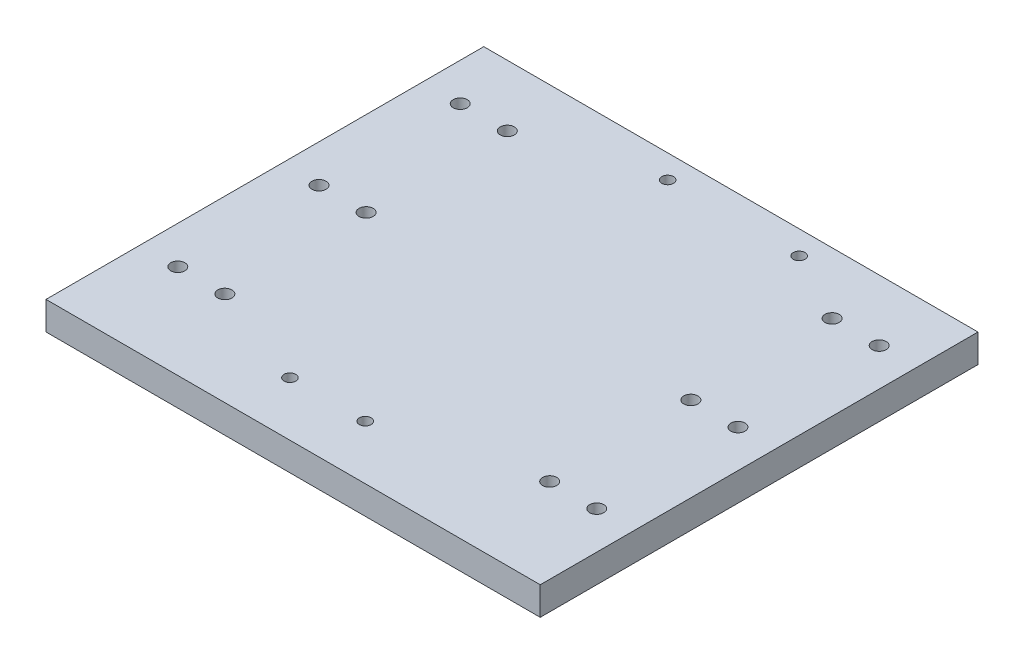
ISO-10303-21;
HEADER;
FILE_DESCRIPTION(('STEP AP214'),'2;1');
FILE_NAME('part.step','',(''),(''),'','','');
FILE_SCHEMA(('AUTOMOTIVE_DESIGN { 1 0 10303 214 1 1 1 1 }'));
ENDSEC;
DATA;
#1=APPLICATION_CONTEXT('core data for automotive mechanical design processes');
#2=APPLICATION_PROTOCOL_DEFINITION('international standard','automotive_design',2000,#1);
#3=PRODUCT_CONTEXT('',#1,'mechanical');
#4=PRODUCT('Part','Part','',(#3));
#5=PRODUCT_RELATED_PRODUCT_CATEGORY('part','',(#4));
#6=PRODUCT_DEFINITION_FORMATION('','',#4);
#7=PRODUCT_DEFINITION_CONTEXT('part definition',#1,'design');
#8=PRODUCT_DEFINITION('design','',#6,#7);
#9=PRODUCT_DEFINITION_SHAPE('','',#8);
#10=(LENGTH_UNIT() NAMED_UNIT(*) SI_UNIT(.MILLI.,.METRE.));
#11=(NAMED_UNIT(*) PLANE_ANGLE_UNIT() SI_UNIT($,.RADIAN.));
#12=(NAMED_UNIT(*) SI_UNIT($,.STERADIAN.) SOLID_ANGLE_UNIT());
#13=UNCERTAINTY_MEASURE_WITH_UNIT(LENGTH_MEASURE(1.E-05),#10,'distance_accuracy_value','');
#14=(GEOMETRIC_REPRESENTATION_CONTEXT(3) GLOBAL_UNCERTAINTY_ASSIGNED_CONTEXT((#13)) GLOBAL_UNIT_ASSIGNED_CONTEXT((#10,
#11,#12)) REPRESENTATION_CONTEXT('',''));
#15=CARTESIAN_POINT('',(0.,0.,0.));
#16=DIRECTION('',(0.,0.,1.));
#17=DIRECTION('',(1.,0.,0.));
#18=AXIS2_PLACEMENT_3D('',#15,#16,#17);
#19=CARTESIAN_POINT('',(0.,6.,0.));
#20=DIRECTION('',(0.,1.,0.));
#21=DIRECTION('',(0.,0.,1.));
#22=AXIS2_PLACEMENT_3D('',#19,#20,#21);
#23=PLANE('',#22);
#24=CARTESIAN_POINT('',(-12.18,6.,-11.5));
#25=DIRECTION('',(0.,1.,0.));
#26=DIRECTION('',(0.,0.,1.));
#27=AXIS2_PLACEMENT_3D('',#24,#25,#26);
#28=CIRCLE('',#27,1.25);
#29=CARTESIAN_POINT('',(-12.18,6.,-10.25));
#30=VERTEX_POINT('',#29);
#31=EDGE_CURVE('E193',#30,#30,#28,.T.);
#32=ORIENTED_EDGE('',*,*,#31,.F.);
#33=EDGE_LOOP('',(#32));
#34=FACE_BOUND('',#33,.T.);
#35=CARTESIAN_POINT('',(-8.44000000000004,6.,-88.));
#36=DIRECTION('',(0.,1.,0.));
#37=DIRECTION('',(0.,0.,1.));
#38=AXIS2_PLACEMENT_3D('',#35,#36,#37);
#39=CIRCLE('',#38,1.25);
#40=CARTESIAN_POINT('',(-8.44000000000004,6.,-86.75));
#41=VERTEX_POINT('',#40);
#42=EDGE_CURVE('E181',#41,#41,#39,.T.);
#43=ORIENTED_EDGE('',*,*,#42,.F.);
#44=EDGE_LOOP('',(#43));
#45=FACE_BOUND('',#44,.T.);
#46=CARTESIAN_POINT('',(-44.5,6.,-80.));
#47=DIRECTION('',(0.,1.,0.));
#48=DIRECTION('',(0.,0.,-1.));
#49=AXIS2_PLACEMENT_3D('',#46,#47,#48);
#50=CIRCLE('',#49,1.5);
#51=CARTESIAN_POINT('',(-44.5,6.,-81.5));
#52=VERTEX_POINT('',#51);
#53=EDGE_CURVE('E169',#52,#52,#50,.T.);
#54=ORIENTED_EDGE('',*,*,#53,.F.);
#55=EDGE_LOOP('',(#54));
#56=FACE_BOUND('',#55,.T.);
#57=CARTESIAN_POINT('',(-44.5,6.,-50.));
#58=DIRECTION('',(0.,1.,0.));
#59=DIRECTION('',(0.,0.,-1.));
#60=AXIS2_PLACEMENT_3D('',#57,#58,#59);
#61=CIRCLE('',#60,1.5);
#62=CARTESIAN_POINT('',(-44.5,6.,-51.5));
#63=VERTEX_POINT('',#62);
#64=EDGE_CURVE('E157',#63,#63,#61,.T.);
#65=ORIENTED_EDGE('',*,*,#64,.F.);
#66=EDGE_LOOP('',(#65));
#67=FACE_BOUND('',#66,.T.);
#68=CARTESIAN_POINT('',(-44.5,6.,-20.));
#69=DIRECTION('',(0.,1.,0.));
#70=DIRECTION('',(0.,0.,-1.));
#71=AXIS2_PLACEMENT_3D('',#68,#69,#70);
#72=CIRCLE('',#71,1.5);
#73=CARTESIAN_POINT('',(-44.5,6.,-21.5));
#74=VERTEX_POINT('',#73);
#75=EDGE_CURVE('E145',#74,#74,#72,.T.);
#76=ORIENTED_EDGE('',*,*,#75,.F.);
#77=EDGE_LOOP('',(#76));
#78=FACE_BOUND('',#77,.T.);
#79=CARTESIAN_POINT('',(34.5,6.,-20.));
#80=DIRECTION('',(0.,1.,0.));
#81=DIRECTION('',(0.,0.,1.));
#82=AXIS2_PLACEMENT_3D('',#79,#80,#81);
#83=CIRCLE('',#82,1.5);
#84=CARTESIAN_POINT('',(34.5,6.,-18.5));
#85=VERTEX_POINT('',#84);
#86=EDGE_CURVE('E133',#85,#85,#83,.T.);
#87=ORIENTED_EDGE('',*,*,#86,.F.);
#88=EDGE_LOOP('',(#87));
#89=FACE_BOUND('',#88,.T.);
#90=CARTESIAN_POINT('',(34.5,6.,-50.));
#91=DIRECTION('',(0.,1.,0.));
#92=DIRECTION('',(0.,0.,1.));
#93=AXIS2_PLACEMENT_3D('',#90,#91,#92);
#94=CIRCLE('',#93,1.5);
#95=CARTESIAN_POINT('',(34.5,6.,-48.5));
#96=VERTEX_POINT('',#95);
#97=EDGE_CURVE('E121',#96,#96,#94,.T.);
#98=ORIENTED_EDGE('',*,*,#97,.F.);
#99=EDGE_LOOP('',(#98));
#100=FACE_BOUND('',#99,.T.);
#101=CARTESIAN_POINT('',(34.5,6.,-80.));
#102=DIRECTION('',(0.,1.,0.));
#103=DIRECTION('',(0.,0.,1.));
#104=AXIS2_PLACEMENT_3D('',#101,#102,#103);
#105=CIRCLE('',#104,1.5);
#106=CARTESIAN_POINT('',(34.5,6.,-78.5));
#107=VERTEX_POINT('',#106);
#108=EDGE_CURVE('E100',#107,#107,#105,.T.);
#109=ORIENTED_EDGE('',*,*,#108,.F.);
#110=EDGE_LOOP('',(#109));
#111=FACE_BOUND('',#110,.T.);
#112=DIRECTION('',(0.,0.,1.));
#113=VECTOR('',#112,1.);
#114=CARTESIAN_POINT('',(-52.5,6.,-93.));
#115=LINE('',#114,#113);
#116=CARTESIAN_POINT('',(-52.5,6.,-93.));
#117=VERTEX_POINT('',#116);
#118=CARTESIAN_POINT('',(-52.5,6.,0.));
#119=VERTEX_POINT('',#118);
#120=EDGE_CURVE('E85',#117,#119,#115,.T.);
#121=ORIENTED_EDGE('',*,*,#120,.T.);
#122=DIRECTION('',(1.,0.,0.));
#123=VECTOR('',#122,1.);
#124=CARTESIAN_POINT('',(-52.5,6.,0.));
#125=LINE('',#124,#123);
#126=CARTESIAN_POINT('',(52.5,6.,0.));
#127=VERTEX_POINT('',#126);
#128=EDGE_CURVE('E80',#119,#127,#125,.T.);
#129=ORIENTED_EDGE('',*,*,#128,.T.);
#130=DIRECTION('',(0.,0.,-1.));
#131=VECTOR('',#130,1.);
#132=CARTESIAN_POINT('',(52.5,6.,-93.));
#133=LINE('',#132,#131);
#134=CARTESIAN_POINT('',(52.5,6.,-93.));
#135=VERTEX_POINT('',#134);
#136=EDGE_CURVE('E83',#127,#135,#133,.T.);
#137=ORIENTED_EDGE('',*,*,#136,.T.);
#138=DIRECTION('',(-1.,0.,0.));
#139=VECTOR('',#138,1.);
#140=CARTESIAN_POINT('',(-52.5,6.,-93.));
#141=LINE('',#140,#139);
#142=EDGE_CURVE('E50',#135,#117,#141,.T.);
#143=ORIENTED_EDGE('',*,*,#142,.T.);
#144=EDGE_LOOP('',(#121,#129,#137,#143));
#145=FACE_BOUND('',#144,.T.);
#146=CARTESIAN_POINT('',(44.5,6.,-80.));
#147=DIRECTION('',(0.,1.,0.));
#148=DIRECTION('',(0.,0.,1.));
#149=AXIS2_PLACEMENT_3D('',#146,#147,#148);
#150=CIRCLE('',#149,1.5);
#151=CARTESIAN_POINT('',(44.5,6.,-78.5));
#152=VERTEX_POINT('',#151);
#153=EDGE_CURVE('E115',#152,#152,#150,.T.);
#154=ORIENTED_EDGE('',*,*,#153,.F.);
#155=EDGE_LOOP('',(#154));
#156=FACE_BOUND('',#155,.T.);
#157=CARTESIAN_POINT('',(44.5,6.,-50.));
#158=DIRECTION('',(0.,1.,0.));
#159=DIRECTION('',(0.,0.,1.));
#160=AXIS2_PLACEMENT_3D('',#157,#158,#159);
#161=CIRCLE('',#160,1.5);
#162=CARTESIAN_POINT('',(44.5,6.,-48.5));
#163=VERTEX_POINT('',#162);
#164=EDGE_CURVE('E127',#163,#163,#161,.T.);
#165=ORIENTED_EDGE('',*,*,#164,.F.);
#166=EDGE_LOOP('',(#165));
#167=FACE_BOUND('',#166,.T.);
#168=CARTESIAN_POINT('',(44.5,6.,-20.));
#169=DIRECTION('',(0.,1.,0.));
#170=DIRECTION('',(0.,0.,1.));
#171=AXIS2_PLACEMENT_3D('',#168,#169,#170);
#172=CIRCLE('',#171,1.5);
#173=CARTESIAN_POINT('',(44.5,6.,-18.5));
#174=VERTEX_POINT('',#173);
#175=EDGE_CURVE('E139',#174,#174,#172,.T.);
#176=ORIENTED_EDGE('',*,*,#175,.F.);
#177=EDGE_LOOP('',(#176));
#178=FACE_BOUND('',#177,.T.);
#179=CARTESIAN_POINT('',(-34.5,6.,-20.));
#180=DIRECTION('',(0.,1.,0.));
#181=DIRECTION('',(0.,0.,-1.));
#182=AXIS2_PLACEMENT_3D('',#179,#180,#181);
#183=CIRCLE('',#182,1.5);
#184=CARTESIAN_POINT('',(-34.5,6.,-21.5));
#185=VERTEX_POINT('',#184);
#186=EDGE_CURVE('E151',#185,#185,#183,.T.);
#187=ORIENTED_EDGE('',*,*,#186,.F.);
#188=EDGE_LOOP('',(#187));
#189=FACE_BOUND('',#188,.T.);
#190=CARTESIAN_POINT('',(-34.5,6.,-50.));
#191=DIRECTION('',(0.,1.,0.));
#192=DIRECTION('',(0.,0.,-1.));
#193=AXIS2_PLACEMENT_3D('',#190,#191,#192);
#194=CIRCLE('',#193,1.5);
#195=CARTESIAN_POINT('',(-34.5,6.,-51.5));
#196=VERTEX_POINT('',#195);
#197=EDGE_CURVE('E163',#196,#196,#194,.T.);
#198=ORIENTED_EDGE('',*,*,#197,.F.);
#199=EDGE_LOOP('',(#198));
#200=FACE_BOUND('',#199,.T.);
#201=CARTESIAN_POINT('',(-34.5,6.,-80.));
#202=DIRECTION('',(0.,1.,0.));
#203=DIRECTION('',(0.,0.,-1.));
#204=AXIS2_PLACEMENT_3D('',#201,#202,#203);
#205=CIRCLE('',#204,1.5);
#206=CARTESIAN_POINT('',(-34.5,6.,-81.5));
#207=VERTEX_POINT('',#206);
#208=EDGE_CURVE('E175',#207,#207,#205,.T.);
#209=ORIENTED_EDGE('',*,*,#208,.F.);
#210=EDGE_LOOP('',(#209));
#211=FACE_BOUND('',#210,.T.);
#212=CARTESIAN_POINT('',(19.5,6.,-88.));
#213=DIRECTION('',(0.,1.,0.));
#214=DIRECTION('',(0.,0.,1.));
#215=AXIS2_PLACEMENT_3D('',#212,#213,#214);
#216=CIRCLE('',#215,1.25);
#217=CARTESIAN_POINT('',(19.5,6.,-86.75));
#218=VERTEX_POINT('',#217);
#219=EDGE_CURVE('E187',#218,#218,#216,.T.);
#220=ORIENTED_EDGE('',*,*,#219,.F.);
#221=EDGE_LOOP('',(#220));
#222=FACE_BOUND('',#221,.T.);
#223=CARTESIAN_POINT('',(3.81999999999997,6.,-11.5));
#224=DIRECTION('',(0.,1.,0.));
#225=DIRECTION('',(0.,0.,1.));
#226=AXIS2_PLACEMENT_3D('',#223,#224,#225);
#227=CIRCLE('',#226,1.25);
#228=CARTESIAN_POINT('',(3.81999999999997,6.,-10.25));
#229=VERTEX_POINT('',#228);
#230=EDGE_CURVE('E199',#229,#229,#227,.T.);
#231=ORIENTED_EDGE('',*,*,#230,.F.);
#232=EDGE_LOOP('',(#231));
#233=FACE_BOUND('',#232,.T.);
#234=ADVANCED_FACE('F33',(#34,#45,#56,#67,#78,#89,#100,#111,#145,#156,#167,#178,#189,#200,#211,
#222,#233),#23,.T.);
#235=CARTESIAN_POINT('',(0.,0.,0.));
#236=DIRECTION('',(0.,1.,0.));
#237=DIRECTION('',(0.,0.,1.));
#238=AXIS2_PLACEMENT_3D('',#235,#236,#237);
#239=PLANE('',#238);
#240=CARTESIAN_POINT('',(-12.18,0.,-11.5));
#241=DIRECTION('',(0.,1.,0.));
#242=DIRECTION('',(0.,0.,1.));
#243=AXIS2_PLACEMENT_3D('',#240,#241,#242);
#244=CIRCLE('',#243,1.25);
#245=CARTESIAN_POINT('',(-12.18,0.,-10.25));
#246=VERTEX_POINT('',#245);
#247=EDGE_CURVE('E196',#246,#246,#244,.T.);
#248=ORIENTED_EDGE('',*,*,#247,.T.);
#249=EDGE_LOOP('',(#248));
#250=FACE_BOUND('',#249,.T.);
#251=CARTESIAN_POINT('',(-8.44000000000004,0.,-88.));
#252=DIRECTION('',(0.,1.,0.));
#253=DIRECTION('',(0.,0.,1.));
#254=AXIS2_PLACEMENT_3D('',#251,#252,#253);
#255=CIRCLE('',#254,1.25);
#256=CARTESIAN_POINT('',(-8.44000000000004,0.,-86.75));
#257=VERTEX_POINT('',#256);
#258=EDGE_CURVE('E184',#257,#257,#255,.T.);
#259=ORIENTED_EDGE('',*,*,#258,.T.);
#260=EDGE_LOOP('',(#259));
#261=FACE_BOUND('',#260,.T.);
#262=CARTESIAN_POINT('',(-44.5,0.,-80.));
#263=DIRECTION('',(0.,1.,0.));
#264=DIRECTION('',(0.,0.,-1.));
#265=AXIS2_PLACEMENT_3D('',#262,#263,#264);
#266=CIRCLE('',#265,1.5);
#267=CARTESIAN_POINT('',(-44.5,0.,-81.5));
#268=VERTEX_POINT('',#267);
#269=EDGE_CURVE('E172',#268,#268,#266,.T.);
#270=ORIENTED_EDGE('',*,*,#269,.T.);
#271=EDGE_LOOP('',(#270));
#272=FACE_BOUND('',#271,.T.);
#273=CARTESIAN_POINT('',(-44.5,0.,-50.));
#274=DIRECTION('',(0.,1.,0.));
#275=DIRECTION('',(0.,0.,-1.));
#276=AXIS2_PLACEMENT_3D('',#273,#274,#275);
#277=CIRCLE('',#276,1.5);
#278=CARTESIAN_POINT('',(-44.5,0.,-51.5));
#279=VERTEX_POINT('',#278);
#280=EDGE_CURVE('E160',#279,#279,#277,.T.);
#281=ORIENTED_EDGE('',*,*,#280,.T.);
#282=EDGE_LOOP('',(#281));
#283=FACE_BOUND('',#282,.T.);
#284=CARTESIAN_POINT('',(-44.5,0.,-20.));
#285=DIRECTION('',(0.,1.,0.));
#286=DIRECTION('',(0.,0.,-1.));
#287=AXIS2_PLACEMENT_3D('',#284,#285,#286);
#288=CIRCLE('',#287,1.5);
#289=CARTESIAN_POINT('',(-44.5,0.,-21.5));
#290=VERTEX_POINT('',#289);
#291=EDGE_CURVE('E148',#290,#290,#288,.T.);
#292=ORIENTED_EDGE('',*,*,#291,.T.);
#293=EDGE_LOOP('',(#292));
#294=FACE_BOUND('',#293,.T.);
#295=CARTESIAN_POINT('',(34.5,0.,-20.));
#296=DIRECTION('',(0.,1.,0.));
#297=DIRECTION('',(0.,0.,1.));
#298=AXIS2_PLACEMENT_3D('',#295,#296,#297);
#299=CIRCLE('',#298,1.5);
#300=CARTESIAN_POINT('',(34.5,0.,-18.5));
#301=VERTEX_POINT('',#300);
#302=EDGE_CURVE('E136',#301,#301,#299,.T.);
#303=ORIENTED_EDGE('',*,*,#302,.T.);
#304=EDGE_LOOP('',(#303));
#305=FACE_BOUND('',#304,.T.);
#306=CARTESIAN_POINT('',(34.5,0.,-50.));
#307=DIRECTION('',(0.,1.,0.));
#308=DIRECTION('',(0.,0.,1.));
#309=AXIS2_PLACEMENT_3D('',#306,#307,#308);
#310=CIRCLE('',#309,1.5);
#311=CARTESIAN_POINT('',(34.5,0.,-48.5));
#312=VERTEX_POINT('',#311);
#313=EDGE_CURVE('E124',#312,#312,#310,.T.);
#314=ORIENTED_EDGE('',*,*,#313,.T.);
#315=EDGE_LOOP('',(#314));
#316=FACE_BOUND('',#315,.T.);
#317=CARTESIAN_POINT('',(34.5,0.,-80.));
#318=DIRECTION('',(0.,1.,0.));
#319=DIRECTION('',(0.,0.,1.));
#320=AXIS2_PLACEMENT_3D('',#317,#318,#319);
#321=CIRCLE('',#320,1.5);
#322=CARTESIAN_POINT('',(34.5,0.,-78.5));
#323=VERTEX_POINT('',#322);
#324=EDGE_CURVE('E112',#323,#323,#321,.T.);
#325=ORIENTED_EDGE('',*,*,#324,.T.);
#326=EDGE_LOOP('',(#325));
#327=FACE_BOUND('',#326,.T.);
#328=DIRECTION('',(0.,0.,1.));
#329=VECTOR('',#328,1.);
#330=CARTESIAN_POINT('',(-52.5,0.,-93.));
#331=LINE('',#330,#329);
#332=CARTESIAN_POINT('',(-52.5,0.,-93.));
#333=VERTEX_POINT('',#332);
#334=CARTESIAN_POINT('',(-52.5,0.,0.));
#335=VERTEX_POINT('',#334);
#336=EDGE_CURVE('E97',#333,#335,#331,.T.);
#337=ORIENTED_EDGE('',*,*,#336,.F.);
#338=DIRECTION('',(-1.,0.,0.));
#339=VECTOR('',#338,1.);
#340=CARTESIAN_POINT('',(-52.5,0.,-93.));
#341=LINE('',#340,#339);
#342=CARTESIAN_POINT('',(52.5,0.,-93.));
#343=VERTEX_POINT('',#342);
#344=EDGE_CURVE('E73',#343,#333,#341,.T.);
#345=ORIENTED_EDGE('',*,*,#344,.F.);
#346=DIRECTION('',(0.,0.,-1.));
#347=VECTOR('',#346,1.);
#348=CARTESIAN_POINT('',(52.5,0.,-93.));
#349=LINE('',#348,#347);
#350=CARTESIAN_POINT('',(52.5,0.,0.));
#351=VERTEX_POINT('',#350);
#352=EDGE_CURVE('E67',#351,#343,#349,.T.);
#353=ORIENTED_EDGE('',*,*,#352,.F.);
#354=DIRECTION('',(1.,0.,0.));
#355=VECTOR('',#354,1.);
#356=CARTESIAN_POINT('',(-52.5,0.,0.));
#357=LINE('',#356,#355);
#358=EDGE_CURVE('E89',#335,#351,#357,.T.);
#359=ORIENTED_EDGE('',*,*,#358,.F.);
#360=EDGE_LOOP('',(#337,#345,#353,#359));
#361=FACE_BOUND('',#360,.T.);
#362=CARTESIAN_POINT('',(44.5,0.,-80.));
#363=DIRECTION('',(0.,1.,0.));
#364=DIRECTION('',(0.,0.,1.));
#365=AXIS2_PLACEMENT_3D('',#362,#363,#364);
#366=CIRCLE('',#365,1.5);
#367=CARTESIAN_POINT('',(44.5,0.,-78.5));
#368=VERTEX_POINT('',#367);
#369=EDGE_CURVE('E118',#368,#368,#366,.T.);
#370=ORIENTED_EDGE('',*,*,#369,.T.);
#371=EDGE_LOOP('',(#370));
#372=FACE_BOUND('',#371,.T.);
#373=CARTESIAN_POINT('',(44.5,0.,-50.));
#374=DIRECTION('',(0.,1.,0.));
#375=DIRECTION('',(0.,0.,1.));
#376=AXIS2_PLACEMENT_3D('',#373,#374,#375);
#377=CIRCLE('',#376,1.5);
#378=CARTESIAN_POINT('',(44.5,0.,-48.5));
#379=VERTEX_POINT('',#378);
#380=EDGE_CURVE('E130',#379,#379,#377,.T.);
#381=ORIENTED_EDGE('',*,*,#380,.T.);
#382=EDGE_LOOP('',(#381));
#383=FACE_BOUND('',#382,.T.);
#384=CARTESIAN_POINT('',(44.5,0.,-20.));
#385=DIRECTION('',(0.,1.,0.));
#386=DIRECTION('',(0.,0.,1.));
#387=AXIS2_PLACEMENT_3D('',#384,#385,#386);
#388=CIRCLE('',#387,1.5);
#389=CARTESIAN_POINT('',(44.5,0.,-18.5));
#390=VERTEX_POINT('',#389);
#391=EDGE_CURVE('E142',#390,#390,#388,.T.);
#392=ORIENTED_EDGE('',*,*,#391,.T.);
#393=EDGE_LOOP('',(#392));
#394=FACE_BOUND('',#393,.T.);
#395=CARTESIAN_POINT('',(-34.5,0.,-20.));
#396=DIRECTION('',(0.,1.,0.));
#397=DIRECTION('',(0.,0.,-1.));
#398=AXIS2_PLACEMENT_3D('',#395,#396,#397);
#399=CIRCLE('',#398,1.5);
#400=CARTESIAN_POINT('',(-34.5,0.,-21.5));
#401=VERTEX_POINT('',#400);
#402=EDGE_CURVE('E154',#401,#401,#399,.T.);
#403=ORIENTED_EDGE('',*,*,#402,.T.);
#404=EDGE_LOOP('',(#403));
#405=FACE_BOUND('',#404,.T.);
#406=CARTESIAN_POINT('',(-34.5,0.,-50.));
#407=DIRECTION('',(0.,1.,0.));
#408=DIRECTION('',(0.,0.,-1.));
#409=AXIS2_PLACEMENT_3D('',#406,#407,#408);
#410=CIRCLE('',#409,1.5);
#411=CARTESIAN_POINT('',(-34.5,0.,-51.5));
#412=VERTEX_POINT('',#411);
#413=EDGE_CURVE('E166',#412,#412,#410,.T.);
#414=ORIENTED_EDGE('',*,*,#413,.T.);
#415=EDGE_LOOP('',(#414));
#416=FACE_BOUND('',#415,.T.);
#417=CARTESIAN_POINT('',(-34.5,0.,-80.));
#418=DIRECTION('',(0.,1.,0.));
#419=DIRECTION('',(0.,0.,-1.));
#420=AXIS2_PLACEMENT_3D('',#417,#418,#419);
#421=CIRCLE('',#420,1.5);
#422=CARTESIAN_POINT('',(-34.5,0.,-81.5));
#423=VERTEX_POINT('',#422);
#424=EDGE_CURVE('E178',#423,#423,#421,.T.);
#425=ORIENTED_EDGE('',*,*,#424,.T.);
#426=EDGE_LOOP('',(#425));
#427=FACE_BOUND('',#426,.T.);
#428=CARTESIAN_POINT('',(19.5,0.,-88.));
#429=DIRECTION('',(0.,1.,0.));
#430=DIRECTION('',(0.,0.,1.));
#431=AXIS2_PLACEMENT_3D('',#428,#429,#430);
#432=CIRCLE('',#431,1.25);
#433=CARTESIAN_POINT('',(19.5,0.,-86.75));
#434=VERTEX_POINT('',#433);
#435=EDGE_CURVE('E190',#434,#434,#432,.T.);
#436=ORIENTED_EDGE('',*,*,#435,.T.);
#437=EDGE_LOOP('',(#436));
#438=FACE_BOUND('',#437,.T.);
#439=CARTESIAN_POINT('',(3.81999999999997,0.,-11.5));
#440=DIRECTION('',(0.,1.,0.));
#441=DIRECTION('',(0.,0.,1.));
#442=AXIS2_PLACEMENT_3D('',#439,#440,#441);
#443=CIRCLE('',#442,1.25);
#444=CARTESIAN_POINT('',(3.81999999999997,0.,-10.25));
#445=VERTEX_POINT('',#444);
#446=EDGE_CURVE('E202',#445,#445,#443,.T.);
#447=ORIENTED_EDGE('',*,*,#446,.T.);
#448=EDGE_LOOP('',(#447));
#449=FACE_BOUND('',#448,.T.);
#450=ADVANCED_FACE('F108',(#250,#261,#272,#283,#294,#305,#316,#327,#361,#372,#383,#394,#405,
#416,#427,#438,#449),#239,.F.);
#451=CARTESIAN_POINT('',(-52.5,6.,-93.));
#452=DIRECTION('',(1.,0.,0.));
#453=DIRECTION('',(0.,0.,-1.));
#454=AXIS2_PLACEMENT_3D('',#451,#452,#453);
#455=PLANE('',#454);
#456=ORIENTED_EDGE('',*,*,#336,.T.);
#457=DIRECTION('',(0.,-1.,0.));
#458=VECTOR('',#457,1.);
#459=CARTESIAN_POINT('',(-52.5,6.,0.));
#460=LINE('',#459,#458);
#461=EDGE_CURVE('E11',#119,#335,#460,.T.);
#462=ORIENTED_EDGE('',*,*,#461,.F.);
#463=ORIENTED_EDGE('',*,*,#120,.F.);
#464=DIRECTION('',(0.,-1.,0.));
#465=VECTOR('',#464,1.);
#466=CARTESIAN_POINT('',(-52.5,6.,-93.));
#467=LINE('',#466,#465);
#468=EDGE_CURVE('E93',#117,#333,#467,.T.);
#469=ORIENTED_EDGE('',*,*,#468,.T.);
#470=EDGE_LOOP('',(#456,#462,#463,#469));
#471=FACE_BOUND('',#470,.T.);
#472=ADVANCED_FACE('F35',(#471),#455,.F.);
#473=CARTESIAN_POINT('',(-52.5,6.,0.));
#474=DIRECTION('',(0.,0.,-1.));
#475=DIRECTION('',(-1.,0.,0.));
#476=AXIS2_PLACEMENT_3D('',#473,#474,#475);
#477=PLANE('',#476);
#478=ORIENTED_EDGE('',*,*,#358,.T.);
#479=DIRECTION('',(0.,-1.,0.));
#480=VECTOR('',#479,1.);
#481=CARTESIAN_POINT('',(52.5,6.,0.));
#482=LINE('',#481,#480);
#483=EDGE_CURVE('E42',#127,#351,#482,.T.);
#484=ORIENTED_EDGE('',*,*,#483,.F.);
#485=ORIENTED_EDGE('',*,*,#128,.F.);
#486=ORIENTED_EDGE('',*,*,#461,.T.);
#487=EDGE_LOOP('',(#478,#484,#485,#486));
#488=FACE_BOUND('',#487,.T.);
#489=ADVANCED_FACE('F88',(#488),#477,.F.);
#490=CARTESIAN_POINT('',(52.5,6.,-93.));
#491=DIRECTION('',(-1.,0.,0.));
#492=DIRECTION('',(0.,0.,1.));
#493=AXIS2_PLACEMENT_3D('',#490,#491,#492);
#494=PLANE('',#493);
#495=ORIENTED_EDGE('',*,*,#352,.T.);
#496=DIRECTION('',(0.,-1.,0.));
#497=VECTOR('',#496,1.);
#498=CARTESIAN_POINT('',(52.5,6.,-93.));
#499=LINE('',#498,#497);
#500=EDGE_CURVE('E90',#135,#343,#499,.T.);
#501=ORIENTED_EDGE('',*,*,#500,.F.);
#502=ORIENTED_EDGE('',*,*,#136,.F.);
#503=ORIENTED_EDGE('',*,*,#483,.T.);
#504=EDGE_LOOP('',(#495,#501,#502,#503));
#505=FACE_BOUND('',#504,.T.);
#506=ADVANCED_FACE('F91',(#505),#494,.F.);
#507=CARTESIAN_POINT('',(-52.5,6.,-93.));
#508=DIRECTION('',(0.,0.,1.));
#509=DIRECTION('',(1.,0.,0.));
#510=AXIS2_PLACEMENT_3D('',#507,#508,#509);
#511=PLANE('',#510);
#512=ORIENTED_EDGE('',*,*,#344,.T.);
#513=ORIENTED_EDGE('',*,*,#468,.F.);
#514=ORIENTED_EDGE('',*,*,#142,.F.);
#515=ORIENTED_EDGE('',*,*,#500,.T.);
#516=EDGE_LOOP('',(#512,#513,#514,#515));
#517=FACE_BOUND('',#516,.T.);
#518=ADVANCED_FACE('F105',(#517),#511,.F.);
#519=CARTESIAN_POINT('',(34.5,6.,-80.));
#520=DIRECTION('',(0.,-1.,0.));
#521=DIRECTION('',(0.,0.,-1.));
#522=AXIS2_PLACEMENT_3D('',#519,#520,#521);
#523=CYLINDRICAL_SURFACE('',#522,1.5);
#524=ORIENTED_EDGE('',*,*,#108,.T.);
#525=EDGE_LOOP('',(#524));
#526=FACE_BOUND('',#525,.T.);
#527=ORIENTED_EDGE('',*,*,#324,.F.);
#528=EDGE_LOOP('',(#527));
#529=FACE_BOUND('',#528,.T.);
#530=ADVANCED_FACE('F222',(#526,#529),#523,.F.);
#531=CARTESIAN_POINT('',(44.5,6.,-80.));
#532=DIRECTION('',(0.,-1.,0.));
#533=DIRECTION('',(0.,0.,-1.));
#534=AXIS2_PLACEMENT_3D('',#531,#532,#533);
#535=CYLINDRICAL_SURFACE('',#534,1.5);
#536=ORIENTED_EDGE('',*,*,#153,.T.);
#537=EDGE_LOOP('',(#536));
#538=FACE_BOUND('',#537,.T.);
#539=ORIENTED_EDGE('',*,*,#369,.F.);
#540=EDGE_LOOP('',(#539));
#541=FACE_BOUND('',#540,.T.);
#542=ADVANCED_FACE('F268',(#538,#541),#535,.F.);
#543=CARTESIAN_POINT('',(34.5,6.,-50.));
#544=DIRECTION('',(0.,-1.,0.));
#545=DIRECTION('',(0.,0.,-1.));
#546=AXIS2_PLACEMENT_3D('',#543,#544,#545);
#547=CYLINDRICAL_SURFACE('',#546,1.5);
#548=ORIENTED_EDGE('',*,*,#97,.T.);
#549=EDGE_LOOP('',(#548));
#550=FACE_BOUND('',#549,.T.);
#551=ORIENTED_EDGE('',*,*,#313,.F.);
#552=EDGE_LOOP('',(#551));
#553=FACE_BOUND('',#552,.T.);
#554=ADVANCED_FACE('F276',(#550,#553),#547,.F.);
#555=CARTESIAN_POINT('',(44.5,6.,-50.));
#556=DIRECTION('',(0.,-1.,0.));
#557=DIRECTION('',(0.,0.,-1.));
#558=AXIS2_PLACEMENT_3D('',#555,#556,#557);
#559=CYLINDRICAL_SURFACE('',#558,1.5);
#560=ORIENTED_EDGE('',*,*,#164,.T.);
#561=EDGE_LOOP('',(#560));
#562=FACE_BOUND('',#561,.T.);
#563=ORIENTED_EDGE('',*,*,#380,.F.);
#564=EDGE_LOOP('',(#563));
#565=FACE_BOUND('',#564,.T.);
#566=ADVANCED_FACE('F284',(#562,#565),#559,.F.);
#567=CARTESIAN_POINT('',(34.5,6.,-20.));
#568=DIRECTION('',(0.,-1.,0.));
#569=DIRECTION('',(0.,0.,-1.));
#570=AXIS2_PLACEMENT_3D('',#567,#568,#569);
#571=CYLINDRICAL_SURFACE('',#570,1.5);
#572=ORIENTED_EDGE('',*,*,#86,.T.);
#573=EDGE_LOOP('',(#572));
#574=FACE_BOUND('',#573,.T.);
#575=ORIENTED_EDGE('',*,*,#302,.F.);
#576=EDGE_LOOP('',(#575));
#577=FACE_BOUND('',#576,.T.);
#578=ADVANCED_FACE('F293',(#574,#577),#571,.F.);
#579=CARTESIAN_POINT('',(44.5,6.,-20.));
#580=DIRECTION('',(0.,-1.,0.));
#581=DIRECTION('',(0.,0.,-1.));
#582=AXIS2_PLACEMENT_3D('',#579,#580,#581);
#583=CYLINDRICAL_SURFACE('',#582,1.5);
#584=ORIENTED_EDGE('',*,*,#175,.T.);
#585=EDGE_LOOP('',(#584));
#586=FACE_BOUND('',#585,.T.);
#587=ORIENTED_EDGE('',*,*,#391,.F.);
#588=EDGE_LOOP('',(#587));
#589=FACE_BOUND('',#588,.T.);
#590=ADVANCED_FACE('F302',(#586,#589),#583,.F.);
#591=CARTESIAN_POINT('',(-44.5,6.,-20.));
#592=DIRECTION('',(0.,-1.,0.));
#593=DIRECTION('',(0.,0.,-1.));
#594=AXIS2_PLACEMENT_3D('',#591,#592,#593);
#595=CYLINDRICAL_SURFACE('',#594,1.5);
#596=ORIENTED_EDGE('',*,*,#75,.T.);
#597=EDGE_LOOP('',(#596));
#598=FACE_BOUND('',#597,.T.);
#599=ORIENTED_EDGE('',*,*,#291,.F.);
#600=EDGE_LOOP('',(#599));
#601=FACE_BOUND('',#600,.T.);
#602=ADVANCED_FACE('F311',(#598,#601),#595,.F.);
#603=CARTESIAN_POINT('',(-34.5,6.,-20.));
#604=DIRECTION('',(0.,-1.,0.));
#605=DIRECTION('',(0.,0.,-1.));
#606=AXIS2_PLACEMENT_3D('',#603,#604,#605);
#607=CYLINDRICAL_SURFACE('',#606,1.5);
#608=ORIENTED_EDGE('',*,*,#186,.T.);
#609=EDGE_LOOP('',(#608));
#610=FACE_BOUND('',#609,.T.);
#611=ORIENTED_EDGE('',*,*,#402,.F.);
#612=EDGE_LOOP('',(#611));
#613=FACE_BOUND('',#612,.T.);
#614=ADVANCED_FACE('F320',(#610,#613),#607,.F.);
#615=CARTESIAN_POINT('',(-44.5,6.,-50.));
#616=DIRECTION('',(0.,-1.,0.));
#617=DIRECTION('',(0.,0.,-1.));
#618=AXIS2_PLACEMENT_3D('',#615,#616,#617);
#619=CYLINDRICAL_SURFACE('',#618,1.5);
#620=ORIENTED_EDGE('',*,*,#64,.T.);
#621=EDGE_LOOP('',(#620));
#622=FACE_BOUND('',#621,.T.);
#623=ORIENTED_EDGE('',*,*,#280,.F.);
#624=EDGE_LOOP('',(#623));
#625=FACE_BOUND('',#624,.T.);
#626=ADVANCED_FACE('F329',(#622,#625),#619,.F.);
#627=CARTESIAN_POINT('',(-34.5,6.,-50.));
#628=DIRECTION('',(0.,-1.,0.));
#629=DIRECTION('',(0.,0.,-1.));
#630=AXIS2_PLACEMENT_3D('',#627,#628,#629);
#631=CYLINDRICAL_SURFACE('',#630,1.5);
#632=ORIENTED_EDGE('',*,*,#197,.T.);
#633=EDGE_LOOP('',(#632));
#634=FACE_BOUND('',#633,.T.);
#635=ORIENTED_EDGE('',*,*,#413,.F.);
#636=EDGE_LOOP('',(#635));
#637=FACE_BOUND('',#636,.T.);
#638=ADVANCED_FACE('F338',(#634,#637),#631,.F.);
#639=CARTESIAN_POINT('',(-44.5,6.,-80.));
#640=DIRECTION('',(0.,-1.,0.));
#641=DIRECTION('',(0.,0.,-1.));
#642=AXIS2_PLACEMENT_3D('',#639,#640,#641);
#643=CYLINDRICAL_SURFACE('',#642,1.5);
#644=ORIENTED_EDGE('',*,*,#53,.T.);
#645=EDGE_LOOP('',(#644));
#646=FACE_BOUND('',#645,.T.);
#647=ORIENTED_EDGE('',*,*,#269,.F.);
#648=EDGE_LOOP('',(#647));
#649=FACE_BOUND('',#648,.T.);
#650=ADVANCED_FACE('F347',(#646,#649),#643,.F.);
#651=CARTESIAN_POINT('',(-34.5,6.,-80.));
#652=DIRECTION('',(0.,-1.,0.));
#653=DIRECTION('',(0.,0.,-1.));
#654=AXIS2_PLACEMENT_3D('',#651,#652,#653);
#655=CYLINDRICAL_SURFACE('',#654,1.5);
#656=ORIENTED_EDGE('',*,*,#208,.T.);
#657=EDGE_LOOP('',(#656));
#658=FACE_BOUND('',#657,.T.);
#659=ORIENTED_EDGE('',*,*,#424,.F.);
#660=EDGE_LOOP('',(#659));
#661=FACE_BOUND('',#660,.T.);
#662=ADVANCED_FACE('F356',(#658,#661),#655,.F.);
#663=CARTESIAN_POINT('',(-8.44000000000004,6.,-88.));
#664=DIRECTION('',(0.,-1.,0.));
#665=DIRECTION('',(0.,0.,-1.));
#666=AXIS2_PLACEMENT_3D('',#663,#664,#665);
#667=CYLINDRICAL_SURFACE('',#666,1.25);
#668=ORIENTED_EDGE('',*,*,#42,.T.);
#669=EDGE_LOOP('',(#668));
#670=FACE_BOUND('',#669,.T.);
#671=ORIENTED_EDGE('',*,*,#258,.F.);
#672=EDGE_LOOP('',(#671));
#673=FACE_BOUND('',#672,.T.);
#674=ADVANCED_FACE('F365',(#670,#673),#667,.F.);
#675=CARTESIAN_POINT('',(19.5,6.,-88.));
#676=DIRECTION('',(0.,-1.,0.));
#677=DIRECTION('',(0.,0.,-1.));
#678=AXIS2_PLACEMENT_3D('',#675,#676,#677);
#679=CYLINDRICAL_SURFACE('',#678,1.25);
#680=ORIENTED_EDGE('',*,*,#219,.T.);
#681=EDGE_LOOP('',(#680));
#682=FACE_BOUND('',#681,.T.);
#683=ORIENTED_EDGE('',*,*,#435,.F.);
#684=EDGE_LOOP('',(#683));
#685=FACE_BOUND('',#684,.T.);
#686=ADVANCED_FACE('F374',(#682,#685),#679,.F.);
#687=CARTESIAN_POINT('',(-12.18,6.,-11.5));
#688=DIRECTION('',(0.,-1.,0.));
#689=DIRECTION('',(0.,0.,-1.));
#690=AXIS2_PLACEMENT_3D('',#687,#688,#689);
#691=CYLINDRICAL_SURFACE('',#690,1.25);
#692=ORIENTED_EDGE('',*,*,#31,.T.);
#693=EDGE_LOOP('',(#692));
#694=FACE_BOUND('',#693,.T.);
#695=ORIENTED_EDGE('',*,*,#247,.F.);
#696=EDGE_LOOP('',(#695));
#697=FACE_BOUND('',#696,.T.);
#698=ADVANCED_FACE('F383',(#694,#697),#691,.F.);
#699=CARTESIAN_POINT('',(3.81999999999997,6.,-11.5));
#700=DIRECTION('',(0.,-1.,0.));
#701=DIRECTION('',(0.,0.,-1.));
#702=AXIS2_PLACEMENT_3D('',#699,#700,#701);
#703=CYLINDRICAL_SURFACE('',#702,1.25);
#704=ORIENTED_EDGE('',*,*,#230,.T.);
#705=EDGE_LOOP('',(#704));
#706=FACE_BOUND('',#705,.T.);
#707=ORIENTED_EDGE('',*,*,#446,.F.);
#708=EDGE_LOOP('',(#707));
#709=FACE_BOUND('',#708,.T.);
#710=ADVANCED_FACE('F208',(#706,#709),#703,.F.);
#711=CLOSED_SHELL('',(#234,#450,#472,#489,#506,#518,#530,#542,#554,#566,#578,#590,#602,#614,
#626,#638,#650,#662,#674,#686,#698,#710));
#712=MANIFOLD_SOLID_BREP('B2',#711);
#713=ADVANCED_BREP_SHAPE_REPRESENTATION('',(#18,#712),#14);
#714=SHAPE_DEFINITION_REPRESENTATION(#9,#713);
ENDSEC;
END-ISO-10303-21;
